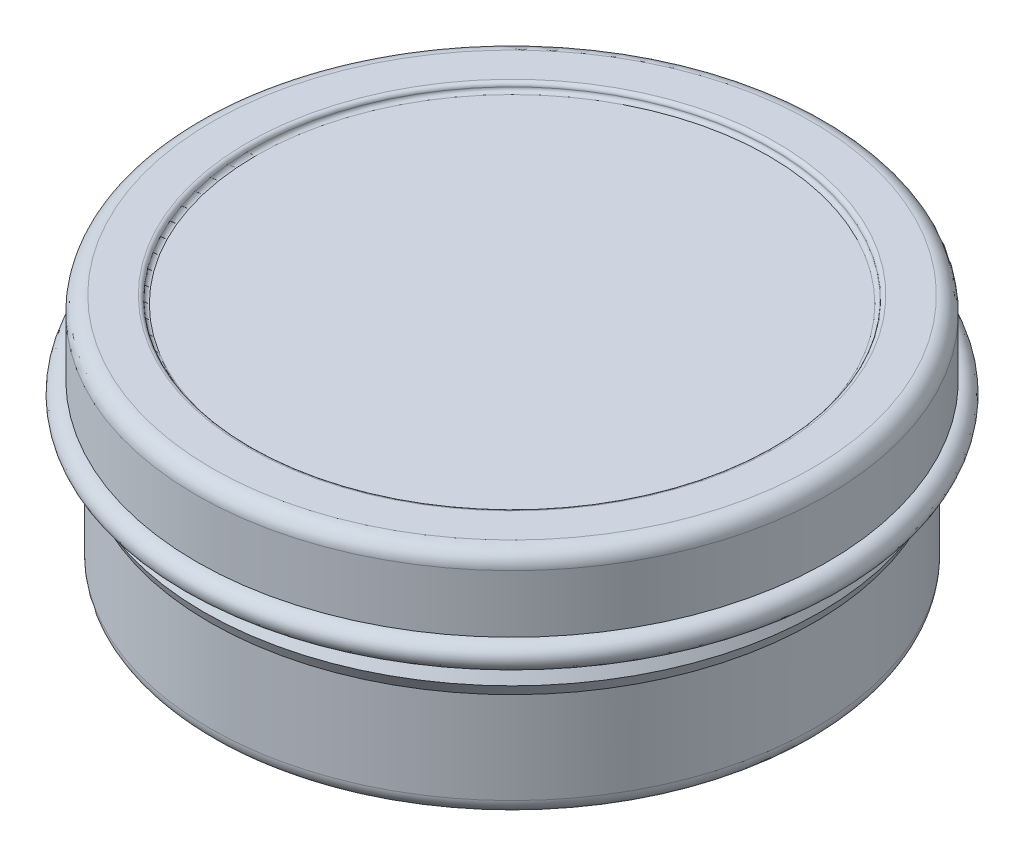
ISO-10303-21;
HEADER;
FILE_DESCRIPTION(('STEP AP214'),'2;1');
FILE_NAME('part.step','',(''),(''),'','','');
FILE_SCHEMA(('AUTOMOTIVE_DESIGN { 1 0 10303 214 1 1 1 1 }'));
ENDSEC;
DATA;
#1=APPLICATION_CONTEXT('core data for automotive mechanical design processes');
#2=APPLICATION_PROTOCOL_DEFINITION('international standard','automotive_design',2000,#1);
#3=PRODUCT_CONTEXT('',#1,'mechanical');
#4=PRODUCT('Part','Part','',(#3));
#5=PRODUCT_RELATED_PRODUCT_CATEGORY('part','',(#4));
#6=PRODUCT_DEFINITION_FORMATION('','',#4);
#7=PRODUCT_DEFINITION_CONTEXT('part definition',#1,'design');
#8=PRODUCT_DEFINITION('design','',#6,#7);
#9=PRODUCT_DEFINITION_SHAPE('','',#8);
#10=(LENGTH_UNIT() NAMED_UNIT(*) SI_UNIT(.MILLI.,.METRE.));
#11=(NAMED_UNIT(*) PLANE_ANGLE_UNIT() SI_UNIT($,.RADIAN.));
#12=(NAMED_UNIT(*) SI_UNIT($,.STERADIAN.) SOLID_ANGLE_UNIT());
#13=UNCERTAINTY_MEASURE_WITH_UNIT(LENGTH_MEASURE(1.E-05),#10,'distance_accuracy_value','');
#14=(GEOMETRIC_REPRESENTATION_CONTEXT(3) GLOBAL_UNCERTAINTY_ASSIGNED_CONTEXT((#13)) GLOBAL_UNIT_ASSIGNED_CONTEXT((#10,
#11,#12)) REPRESENTATION_CONTEXT('',''));
#15=CARTESIAN_POINT('',(0.,0.,0.));
#16=DIRECTION('',(0.,0.,1.));
#17=DIRECTION('',(1.,0.,0.));
#18=AXIS2_PLACEMENT_3D('',#15,#16,#17);
#19=CARTESIAN_POINT('',(-20.3,15.41,0.));
#20=DIRECTION('',(0.,1.,0.));
#21=DIRECTION('',(0.,0.,1.));
#22=AXIS2_PLACEMENT_3D('',#19,#20,#21);
#23=PLANE('',#22);
#24=CARTESIAN_POINT('',(0.,15.41,0.));
#25=DIRECTION('',(0.,1.,0.));
#26=DIRECTION('',(0.,0.,1.));
#27=AXIS2_PLACEMENT_3D('',#24,#25,#26);
#28=CIRCLE('',#27,17.);
#29=CARTESIAN_POINT('',(0.,15.41,17.));
#30=VERTEX_POINT('',#29);
#31=EDGE_CURVE('E10',#30,#30,#28,.F.);
#32=ORIENTED_EDGE('',*,*,#31,.T.);
#33=EDGE_LOOP('',(#32));
#34=FACE_BOUND('',#33,.T.);
#35=CARTESIAN_POINT('',(0.,15.41,0.));
#36=DIRECTION('',(0.,1.,0.));
#37=DIRECTION('',(0.,0.,1.));
#38=AXIS2_PLACEMENT_3D('',#35,#36,#37);
#39=CIRCLE('',#38,19.3);
#40=CARTESIAN_POINT('',(0.,15.41,19.3));
#41=VERTEX_POINT('',#40);
#42=EDGE_CURVE('E59',#41,#41,#39,.T.);
#43=ORIENTED_EDGE('',*,*,#42,.T.);
#44=EDGE_LOOP('',(#43));
#45=FACE_BOUND('',#44,.T.);
#46=ADVANCED_FACE('F36',(#34,#45),#23,.T.);
#47=CARTESIAN_POINT('',(0.,24.5223538498266,0.));
#48=DIRECTION('',(0.,1.,0.));
#49=DIRECTION('',(0.,0.,1.));
#50=AXIS2_PLACEMENT_3D('',#47,#48,#49);
#51=CYLINDRICAL_SURFACE('',#50,20.3);
#52=CARTESIAN_POINT('',(0.,14.41,0.));
#53=DIRECTION('',(0.,1.,0.));
#54=DIRECTION('',(0.,0.,1.));
#55=AXIS2_PLACEMENT_3D('',#52,#53,#54);
#56=CIRCLE('',#55,20.3);
#57=CARTESIAN_POINT('',(0.,14.41,20.3));
#58=VERTEX_POINT('',#57);
#59=EDGE_CURVE('E56',#58,#58,#56,.F.);
#60=ORIENTED_EDGE('',*,*,#59,.T.);
#61=EDGE_LOOP('',(#60));
#62=FACE_BOUND('',#61,.T.);
#63=CARTESIAN_POINT('',(0.,10.6999999999999,0.));
#64=DIRECTION('',(0.,1.,0.));
#65=DIRECTION('',(0.,0.,1.));
#66=AXIS2_PLACEMENT_3D('',#63,#64,#65);
#67=CIRCLE('',#66,20.3);
#68=CARTESIAN_POINT('',(0.,10.6999999999999,20.3));
#69=VERTEX_POINT('',#68);
#70=EDGE_CURVE('E62',#69,#69,#67,.T.);
#71=ORIENTED_EDGE('',*,*,#70,.T.);
#72=EDGE_LOOP('',(#71));
#73=FACE_BOUND('',#72,.T.);
#74=ADVANCED_FACE('F87',(#62,#73),#51,.T.);
#75=CARTESIAN_POINT('',(-20.3,9.89999999999992,0.));
#76=DIRECTION('',(0.,0.,1.));
#77=DIRECTION('',(-1.,0.,0.));
#78=AXIS2_PLACEMENT_3D('',#75,#76,#77);
#79=ELLIPSE('',#78,0.899999999999998,0.8);
#80=CARTESIAN_POINT('',(0.,24.5223538498266,0.));
#81=DIRECTION('',(0.,1.,0.));
#82=AXIS1_PLACEMENT('',#80,#81);
#83=SURFACE_OF_REVOLUTION('',#79,#82);
#84=CARTESIAN_POINT('',(0.,9.09999999999992,0.));
#85=DIRECTION('',(0.,1.,0.));
#86=DIRECTION('',(0.,0.,1.));
#87=AXIS2_PLACEMENT_3D('',#84,#85,#86);
#88=CIRCLE('',#87,20.3);
#89=CARTESIAN_POINT('',(0.,9.09999999999992,20.3));
#90=VERTEX_POINT('',#89);
#91=EDGE_CURVE('E65',#90,#90,#88,.T.);
#92=ORIENTED_EDGE('',*,*,#91,.T.);
#93=EDGE_LOOP('',(#92));
#94=FACE_BOUND('',#93,.T.);
#95=ORIENTED_EDGE('',*,*,#70,.F.);
#96=EDGE_LOOP('',(#95));
#97=FACE_BOUND('',#96,.T.);
#98=ADVANCED_FACE('F82',(#94,#97),#83,.F.);
#99=CARTESIAN_POINT('',(-19.45,9.09999999999996,0.));
#100=DIRECTION('',(0.,-1.,0.));
#101=DIRECTION('',(0.,0.,-1.));
#102=AXIS2_PLACEMENT_3D('',#99,#100,#101);
#103=PLANE('',#102);
#104=CARTESIAN_POINT('',(0.,9.1,0.));
#105=DIRECTION('',(0.,1.,0.));
#106=DIRECTION('',(0.,0.,1.));
#107=AXIS2_PLACEMENT_3D('',#104,#105,#106);
#108=CIRCLE('',#107,19.45);
#109=CARTESIAN_POINT('',(0.,9.1,19.45));
#110=VERTEX_POINT('',#109);
#111=EDGE_CURVE('E68',#110,#110,#108,.T.);
#112=ORIENTED_EDGE('',*,*,#111,.T.);
#113=EDGE_LOOP('',(#112));
#114=FACE_BOUND('',#113,.T.);
#115=ORIENTED_EDGE('',*,*,#91,.F.);
#116=EDGE_LOOP('',(#115));
#117=FACE_BOUND('',#116,.T.);
#118=ADVANCED_FACE('F86',(#114,#117),#103,.T.);
#119=CARTESIAN_POINT('',(0.,24.5223538498266,0.));
#120=DIRECTION('',(0.,1.,0.));
#121=DIRECTION('',(0.,0.,1.));
#122=AXIS2_PLACEMENT_3D('',#119,#120,#121);
#123=CYLINDRICAL_SURFACE('',#122,19.45);
#124=CARTESIAN_POINT('',(0.,8.41508344370672,0.));
#125=DIRECTION('',(0.,1.,0.));
#126=DIRECTION('',(0.,0.,1.));
#127=AXIS2_PLACEMENT_3D('',#124,#125,#126);
#128=CIRCLE('',#127,19.45);
#129=CARTESIAN_POINT('',(0.,8.41508344370672,19.45));
#130=VERTEX_POINT('',#129);
#131=EDGE_CURVE('E71',#130,#130,#128,.T.);
#132=ORIENTED_EDGE('',*,*,#131,.T.);
#133=EDGE_LOOP('',(#132));
#134=FACE_BOUND('',#133,.T.);
#135=ORIENTED_EDGE('',*,*,#111,.F.);
#136=EDGE_LOOP('',(#135));
#137=FACE_BOUND('',#136,.T.);
#138=ADVANCED_FACE('F134',(#134,#137),#123,.T.);
#139=CARTESIAN_POINT('',(0.,8.41508344370672,0.));
#140=DIRECTION('',(0.,-1.,0.));
#141=DIRECTION('',(0.,0.,-1.));
#142=AXIS2_PLACEMENT_3D('',#139,#140,#141);
#143=CONICAL_SURFACE('',#142,19.45,0.459657477319515);
#144=CARTESIAN_POINT('',(0.,7.65754172185336,0.));
#145=DIRECTION('',(0.,1.,0.));
#146=DIRECTION('',(0.,0.,1.));
#147=AXIS2_PLACEMENT_3D('',#144,#145,#146);
#148=CIRCLE('',#147,19.825);
#149=CARTESIAN_POINT('',(0.,7.65754172185336,19.825));
#150=VERTEX_POINT('',#149);
#151=EDGE_CURVE('E74',#150,#150,#148,.T.);
#152=ORIENTED_EDGE('',*,*,#151,.T.);
#153=EDGE_LOOP('',(#152));
#154=FACE_BOUND('',#153,.T.);
#155=ORIENTED_EDGE('',*,*,#131,.F.);
#156=EDGE_LOOP('',(#155));
#157=FACE_BOUND('',#156,.T.);
#158=ADVANCED_FACE('F131',(#154,#157),#143,.T.);
#159=CARTESIAN_POINT('',(0.,7.65754172185336,0.));
#160=DIRECTION('',(0.,1.,0.));
#161=DIRECTION('',(0.,0.,1.));
#162=AXIS2_PLACEMENT_3D('',#159,#160,#161);
#163=CONICAL_SURFACE('',#162,19.825,0.459657477319513);
#164=CARTESIAN_POINT('',(0.,6.9,0.));
#165=DIRECTION('',(0.,1.,0.));
#166=DIRECTION('',(0.,0.,1.));
#167=AXIS2_PLACEMENT_3D('',#164,#165,#166);
#168=CIRCLE('',#167,19.45);
#169=CARTESIAN_POINT('',(0.,6.9,19.45));
#170=VERTEX_POINT('',#169);
#171=EDGE_CURVE('E77',#170,#170,#168,.T.);
#172=ORIENTED_EDGE('',*,*,#171,.T.);
#173=EDGE_LOOP('',(#172));
#174=FACE_BOUND('',#173,.T.);
#175=ORIENTED_EDGE('',*,*,#151,.F.);
#176=EDGE_LOOP('',(#175));
#177=FACE_BOUND('',#176,.T.);
#178=ADVANCED_FACE('F127',(#174,#177),#163,.T.);
#179=CARTESIAN_POINT('',(0.,24.5223538498266,0.));
#180=DIRECTION('',(0.,1.,0.));
#181=DIRECTION('',(0.,0.,1.));
#182=AXIS2_PLACEMENT_3D('',#179,#180,#181);
#183=CYLINDRICAL_SURFACE('',#182,19.45);
#184=CARTESIAN_POINT('',(0.,0.999999999999997,0.));
#185=DIRECTION('',(0.,-1.,0.));
#186=DIRECTION('',(0.,0.,-1.));
#187=AXIS2_PLACEMENT_3D('',#184,#185,#186);
#188=CIRCLE('',#187,19.45);
#189=CARTESIAN_POINT('',(0.,0.999999999999997,-19.45));
#190=VERTEX_POINT('',#189);
#191=EDGE_CURVE('E53',#190,#190,#188,.F.);
#192=ORIENTED_EDGE('',*,*,#191,.T.);
#193=EDGE_LOOP('',(#192));
#194=FACE_BOUND('',#193,.T.);
#195=ORIENTED_EDGE('',*,*,#171,.F.);
#196=EDGE_LOOP('',(#195));
#197=FACE_BOUND('',#196,.T.);
#198=ADVANCED_FACE('F121',(#194,#197),#183,.T.);
#199=CARTESIAN_POINT('',(0.,0.,0.));
#200=DIRECTION('',(0.,-1.,0.));
#201=DIRECTION('',(0.,0.,-1.));
#202=AXIS2_PLACEMENT_3D('',#199,#200,#201);
#203=PLANE('',#202);
#204=CARTESIAN_POINT('',(0.,0.,0.));
#205=DIRECTION('',(0.,-1.,0.));
#206=DIRECTION('',(0.,0.,-1.));
#207=AXIS2_PLACEMENT_3D('',#204,#205,#206);
#208=CIRCLE('',#207,18.45);
#209=CARTESIAN_POINT('',(0.,0.,-18.45));
#210=VERTEX_POINT('',#209);
#211=EDGE_CURVE('E48',#210,#210,#208,.T.);
#212=ORIENTED_EDGE('',*,*,#211,.T.);
#213=EDGE_LOOP('',(#212));
#214=FACE_BOUND('',#213,.T.);
#215=ADVANCED_FACE('F116',(#214),#203,.T.);
#216=CARTESIAN_POINT('',(0.,14.91,0.));
#217=DIRECTION('',(0.,1.,0.));
#218=DIRECTION('',(0.,0.,1.));
#219=AXIS2_PLACEMENT_3D('',#216,#217,#218);
#220=PLANE('',#219);
#221=CARTESIAN_POINT('',(0.,14.91,0.));
#222=DIRECTION('',(0.,1.,0.));
#223=DIRECTION('',(0.,0.,1.));
#224=AXIS2_PLACEMENT_3D('',#221,#222,#223);
#225=CIRCLE('',#224,16.5);
#226=CARTESIAN_POINT('',(0.,14.91,16.5));
#227=VERTEX_POINT('',#226);
#228=EDGE_CURVE('E44',#227,#227,#225,.T.);
#229=ORIENTED_EDGE('',*,*,#228,.T.);
#230=EDGE_LOOP('',(#229));
#231=FACE_BOUND('',#230,.T.);
#232=ADVANCED_FACE('F99',(#231),#220,.T.);
#233=CARTESIAN_POINT('',(0.,14.41,0.));
#234=DIRECTION('',(0.,1.,0.));
#235=DIRECTION('',(0.,0.,1.));
#236=AXIS2_PLACEMENT_3D('',#233,#234,#235);
#237=TOROIDAL_SURFACE('',#236,19.3,1.);
#238=ORIENTED_EDGE('',*,*,#59,.F.);
#239=EDGE_LOOP('',(#238));
#240=FACE_BOUND('',#239,.T.);
#241=ORIENTED_EDGE('',*,*,#42,.F.);
#242=EDGE_LOOP('',(#241));
#243=FACE_BOUND('',#242,.T.);
#244=ADVANCED_FACE('F95',(#240,#243),#237,.T.);
#245=CARTESIAN_POINT('',(0.,0.999999999999997,0.));
#246=DIRECTION('',(0.,-1.,0.));
#247=DIRECTION('',(0.,0.,-1.));
#248=AXIS2_PLACEMENT_3D('',#245,#246,#247);
#249=TOROIDAL_SURFACE('',#248,18.45,1.);
#250=ORIENTED_EDGE('',*,*,#211,.F.);
#251=EDGE_LOOP('',(#250));
#252=FACE_BOUND('',#251,.T.);
#253=ORIENTED_EDGE('',*,*,#191,.F.);
#254=EDGE_LOOP('',(#253));
#255=FACE_BOUND('',#254,.T.);
#256=ADVANCED_FACE('F98',(#252,#255),#249,.T.);
#257=CARTESIAN_POINT('',(0.,15.16,0.));
#258=DIRECTION('',(0.,1.,0.));
#259=DIRECTION('',(0.,0.,1.));
#260=AXIS2_PLACEMENT_3D('',#257,#258,#259);
#261=TOROIDAL_SURFACE('',#260,17.,0.25);
#262=ORIENTED_EDGE('',*,*,#31,.F.);
#263=EDGE_LOOP('',(#262));
#264=FACE_BOUND('',#263,.T.);
#265=CARTESIAN_POINT('',(0.,15.16,0.));
#266=DIRECTION('',(0.,1.,0.));
#267=DIRECTION('',(0.,0.,1.));
#268=AXIS2_PLACEMENT_3D('',#265,#266,#267);
#269=CIRCLE('',#268,16.75);
#270=CARTESIAN_POINT('',(0.,15.16,16.75));
#271=VERTEX_POINT('',#270);
#272=EDGE_CURVE('E40',#271,#271,#269,.T.);
#273=ORIENTED_EDGE('',*,*,#272,.F.);
#274=EDGE_LOOP('',(#273));
#275=FACE_BOUND('',#274,.T.);
#276=ADVANCED_FACE('F38',(#264,#275),#261,.T.);
#277=CARTESIAN_POINT('',(0.,15.16,0.));
#278=DIRECTION('',(0.,1.,0.));
#279=DIRECTION('',(0.,0.,1.));
#280=AXIS2_PLACEMENT_3D('',#277,#278,#279);
#281=TOROIDAL_SURFACE('',#280,16.5,0.25);
#282=ORIENTED_EDGE('',*,*,#272,.T.);
#283=EDGE_LOOP('',(#282));
#284=FACE_BOUND('',#283,.T.);
#285=ORIENTED_EDGE('',*,*,#228,.F.);
#286=EDGE_LOOP('',(#285));
#287=FACE_BOUND('',#286,.T.);
#288=ADVANCED_FACE('F103',(#284,#287),#281,.F.);
#289=CLOSED_SHELL('',(#46,#74,#98,#118,#138,#158,#178,#198,#215,#232,#244,#256,#276,#288));
#290=MANIFOLD_SOLID_BREP('B2',#289);
#291=ADVANCED_BREP_SHAPE_REPRESENTATION('',(#18,#290),#14);
#292=SHAPE_DEFINITION_REPRESENTATION(#9,#291);
ENDSEC;
END-ISO-10303-21;
